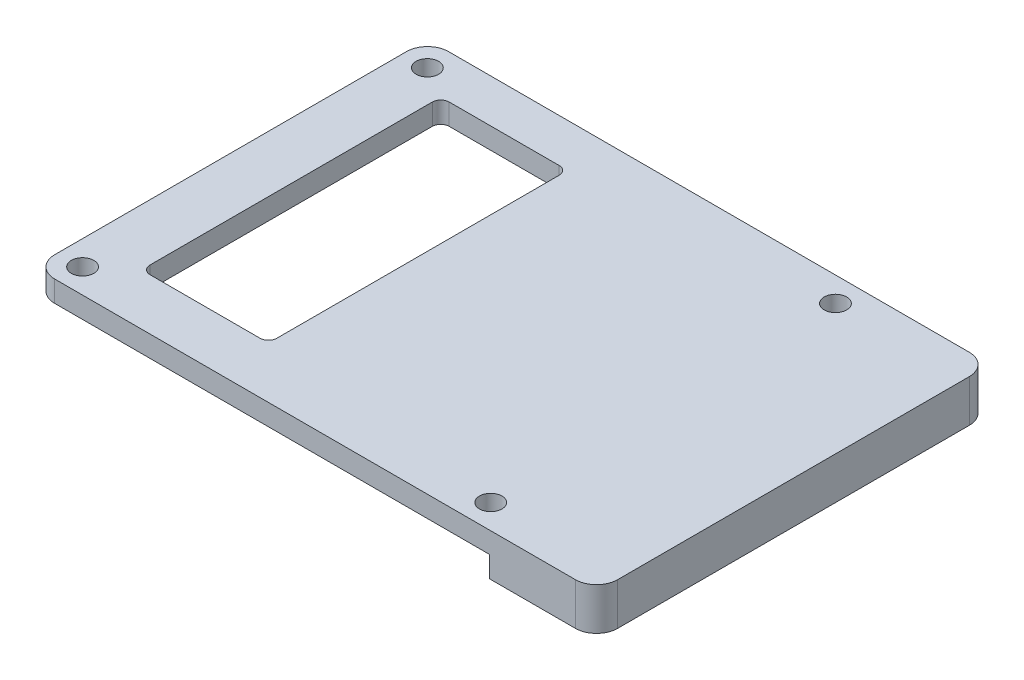
ISO-10303-21;
HEADER;
FILE_DESCRIPTION(('STEP AP214'),'2;1');
FILE_NAME('part.step','',(''),(''),'','','');
FILE_SCHEMA(('AUTOMOTIVE_DESIGN { 1 0 10303 214 1 1 1 1 }'));
ENDSEC;
DATA;
#1=APPLICATION_CONTEXT('core data for automotive mechanical design processes');
#2=APPLICATION_PROTOCOL_DEFINITION('international standard','automotive_design',2000,#1);
#3=PRODUCT_CONTEXT('',#1,'mechanical');
#4=PRODUCT('Part','Part','',(#3));
#5=PRODUCT_RELATED_PRODUCT_CATEGORY('part','',(#4));
#6=PRODUCT_DEFINITION_FORMATION('','',#4);
#7=PRODUCT_DEFINITION_CONTEXT('part definition',#1,'design');
#8=PRODUCT_DEFINITION('design','',#6,#7);
#9=PRODUCT_DEFINITION_SHAPE('','',#8);
#10=(LENGTH_UNIT() NAMED_UNIT(*) SI_UNIT(.MILLI.,.METRE.));
#11=(NAMED_UNIT(*) PLANE_ANGLE_UNIT() SI_UNIT($,.RADIAN.));
#12=(NAMED_UNIT(*) SI_UNIT($,.STERADIAN.) SOLID_ANGLE_UNIT());
#13=UNCERTAINTY_MEASURE_WITH_UNIT(LENGTH_MEASURE(1.E-05),#10,'distance_accuracy_value','');
#14=(GEOMETRIC_REPRESENTATION_CONTEXT(3) GLOBAL_UNCERTAINTY_ASSIGNED_CONTEXT((#13)) GLOBAL_UNIT_ASSIGNED_CONTEXT((#10,
#11,#12)) REPRESENTATION_CONTEXT('',''));
#15=CARTESIAN_POINT('',(0.,0.,0.));
#16=DIRECTION('',(0.,0.,1.));
#17=DIRECTION('',(1.,0.,0.));
#18=AXIS2_PLACEMENT_3D('',#15,#16,#17);
#19=CARTESIAN_POINT('',(-77.0217231267692,0.,-21.4026703774337));
#20=DIRECTION('',(0.,1.,0.));
#21=DIRECTION('',(0.,0.,1.));
#22=AXIS2_PLACEMENT_3D('',#19,#20,#21);
#23=PLANE('',#22);
#24=CARTESIAN_POINT('',(-70.7700597308106,0.,-17.0302829865601));
#25=DIRECTION('',(0.,1.,0.));
#26=DIRECTION('',(0.,0.,1.));
#27=AXIS2_PLACEMENT_3D('',#24,#25,#26);
#28=CIRCLE('',#27,1.2);
#29=CARTESIAN_POINT('',(-70.7700597308106,0.,-18.2302829865601));
#30=VERTEX_POINT('',#29);
#31=CARTESIAN_POINT('',(-71.9700597308106,0.,-17.03028298656));
#32=VERTEX_POINT('',#31);
#33=EDGE_CURVE('E189',#30,#32,#28,.T.);
#34=ORIENTED_EDGE('',*,*,#33,.T.);
#35=DIRECTION('',(0.,0.,1.));
#36=VECTOR('',#35,1.);
#37=CARTESIAN_POINT('',(-71.9700597308106,0.,-17.03028298656));
#38=LINE('',#37,#36);
#39=CARTESIAN_POINT('',(-71.9700597308106,0.,23.0884223106065));
#40=VERTEX_POINT('',#39);
#41=EDGE_CURVE('E193',#32,#40,#38,.T.);
#42=ORIENTED_EDGE('',*,*,#41,.T.);
#43=CARTESIAN_POINT('',(-70.7700597308106,0.,23.0884223106065));
#44=DIRECTION('',(0.,1.,0.));
#45=DIRECTION('',(0.,0.,-1.));
#46=AXIS2_PLACEMENT_3D('',#43,#44,#45);
#47=CIRCLE('',#46,1.2);
#48=CARTESIAN_POINT('',(-70.7700597308106,0.,24.2884223106065));
#49=VERTEX_POINT('',#48);
#50=EDGE_CURVE('E218',#40,#49,#47,.T.);
#51=ORIENTED_EDGE('',*,*,#50,.T.);
#52=DIRECTION('',(1.,0.,0.));
#53=VECTOR('',#52,1.);
#54=CARTESIAN_POINT('',(-70.7700597308106,0.,24.2884223106065));
#55=LINE('',#54,#53);
#56=CARTESIAN_POINT('',(-55.140568983521,0.,24.2884223106065));
#57=VERTEX_POINT('',#56);
#58=EDGE_CURVE('E221',#49,#57,#55,.T.);
#59=ORIENTED_EDGE('',*,*,#58,.T.);
#60=CARTESIAN_POINT('',(-55.140568983521,0.,23.0884223106065));
#61=DIRECTION('',(0.,1.,0.));
#62=DIRECTION('',(0.,0.,-1.));
#63=AXIS2_PLACEMENT_3D('',#60,#61,#62);
#64=CIRCLE('',#63,1.2);
#65=CARTESIAN_POINT('',(-53.940568983521,0.,23.0884223106065));
#66=VERTEX_POINT('',#65);
#67=EDGE_CURVE('E224',#57,#66,#64,.T.);
#68=ORIENTED_EDGE('',*,*,#67,.T.);
#69=DIRECTION('',(0.,0.,-1.));
#70=VECTOR('',#69,1.);
#71=CARTESIAN_POINT('',(-53.940568983521,0.,-17.03028298656));
#72=LINE('',#71,#70);
#73=CARTESIAN_POINT('',(-53.940568983521,0.,-17.03028298656));
#74=VERTEX_POINT('',#73);
#75=EDGE_CURVE('E227',#66,#74,#72,.T.);
#76=ORIENTED_EDGE('',*,*,#75,.T.);
#77=CARTESIAN_POINT('',(-55.140568983521,0.,-17.0302829865601));
#78=DIRECTION('',(0.,1.,0.));
#79=DIRECTION('',(0.,0.,1.));
#80=AXIS2_PLACEMENT_3D('',#77,#78,#79);
#81=CIRCLE('',#80,1.2);
#82=CARTESIAN_POINT('',(-55.140568983521,0.,-18.2302829865601));
#83=VERTEX_POINT('',#82);
#84=EDGE_CURVE('E230',#74,#83,#81,.T.);
#85=ORIENTED_EDGE('',*,*,#84,.T.);
#86=DIRECTION('',(-1.,0.,0.));
#87=VECTOR('',#86,1.);
#88=CARTESIAN_POINT('',(-70.7700597308106,0.,-18.2302829865601));
#89=LINE('',#88,#87);
#90=EDGE_CURVE('E201',#83,#30,#89,.T.);
#91=ORIENTED_EDGE('',*,*,#90,.T.);
#92=EDGE_LOOP('',(#34,#42,#51,#59,#68,#76,#85,#91));
#93=FACE_BOUND('',#92,.T.);
#94=CARTESIAN_POINT('',(-76.5284846202892,0.,-20.8867242255417));
#95=DIRECTION('',(0.,1.,0.));
#96=DIRECTION('',(0.,0.,1.));
#97=AXIS2_PLACEMENT_3D('',#94,#95,#96);
#98=CIRCLE('',#97,1.6);
#99=CARTESIAN_POINT('',(-76.5284846202892,0.,-19.2867242255417));
#100=VERTEX_POINT('',#99);
#101=EDGE_CURVE('E267',#100,#100,#98,.T.);
#102=ORIENTED_EDGE('',*,*,#101,.T.);
#103=EDGE_LOOP('',(#102));
#104=FACE_BOUND('',#103,.T.);
#105=CARTESIAN_POINT('',(-18.5285862204952,0.,-20.8865972252877));
#106=DIRECTION('',(0.,1.,0.));
#107=DIRECTION('',(0.,0.,1.));
#108=AXIS2_PLACEMENT_3D('',#105,#106,#107);
#109=CIRCLE('',#108,1.6);
#110=CARTESIAN_POINT('',(-18.5285862204952,0.,-19.2865972252877));
#111=VERTEX_POINT('',#110);
#112=EDGE_CURVE('E261',#111,#111,#109,.T.);
#113=ORIENTED_EDGE('',*,*,#112,.T.);
#114=EDGE_LOOP('',(#113));
#115=FACE_BOUND('',#114,.T.);
#116=CARTESIAN_POINT('',(-18.5283322199872,0.,28.1136567752183));
#117=DIRECTION('',(0.,1.,0.));
#118=DIRECTION('',(0.,0.,1.));
#119=AXIS2_PLACEMENT_3D('',#116,#117,#118);
#120=CIRCLE('',#119,1.6);
#121=CARTESIAN_POINT('',(-18.5283322199872,0.,29.7136567752183));
#122=VERTEX_POINT('',#121);
#123=EDGE_CURVE('E255',#122,#122,#120,.T.);
#124=ORIENTED_EDGE('',*,*,#123,.T.);
#125=EDGE_LOOP('',(#124));
#126=FACE_BOUND('',#125,.T.);
#127=CARTESIAN_POINT('',(-76.5283322199792,0.,28.1135297749583));
#128=DIRECTION('',(0.,1.,0.));
#129=DIRECTION('',(0.,0.,1.));
#130=AXIS2_PLACEMENT_3D('',#127,#128,#129);
#131=CIRCLE('',#130,1.6);
#132=CARTESIAN_POINT('',(-76.5283322199792,0.,29.7135297749583));
#133=VERTEX_POINT('',#132);
#134=EDGE_CURVE('E251',#133,#133,#131,.T.);
#135=ORIENTED_EDGE('',*,*,#134,.T.);
#136=EDGE_LOOP('',(#135));
#137=FACE_BOUND('',#136,.T.);
#138=DIRECTION('',(0.,0.,-1.));
#139=VECTOR('',#138,1.);
#140=CARTESIAN_POINT('',(-15.2270796572365,0.,31.5917365313783));
#141=LINE('',#140,#139);
#142=CARTESIAN_POINT('',(-15.2270796572365,0.,31.5917365313783));
#143=VERTEX_POINT('',#142);
#144=CARTESIAN_POINT('',(-15.2270796572365,0.,-24.3899754320437));
#145=VERTEX_POINT('',#144);
#146=EDGE_CURVE('E54',#143,#145,#141,.T.);
#147=ORIENTED_EDGE('',*,*,#146,.F.);
#148=DIRECTION('',(1.,0.,0.));
#149=VECTOR('',#148,1.);
#150=CARTESIAN_POINT('',(-77.0217231267692,0.,31.5917365313783));
#151=LINE('',#150,#149);
#152=CARTESIAN_POINT('',(-77.0217231267692,0.,31.5917365313783));
#153=VERTEX_POINT('',#152);
#154=EDGE_CURVE('E301',#153,#143,#151,.T.);
#155=ORIENTED_EDGE('',*,*,#154,.F.);
#156=CARTESIAN_POINT('',(-77.0217231267692,0.,28.6044314767683));
#157=DIRECTION('',(0.,1.,0.));
#158=DIRECTION('',(0.,0.,1.));
#159=AXIS2_PLACEMENT_3D('',#156,#157,#158);
#160=CIRCLE('',#159,2.98730505460999);
#161=CARTESIAN_POINT('',(-80.0090281813792,0.,28.6044314767683));
#162=VERTEX_POINT('',#161);
#163=EDGE_CURVE('E299',#162,#153,#160,.T.);
#164=ORIENTED_EDGE('',*,*,#163,.F.);
#165=DIRECTION('',(0.,0.,1.));
#166=VECTOR('',#165,1.);
#167=CARTESIAN_POINT('',(-80.0090281813792,0.,-21.4026703774337));
#168=LINE('',#167,#166);
#169=CARTESIAN_POINT('',(-80.0090281813792,0.,-21.4026703774337));
#170=VERTEX_POINT('',#169);
#171=EDGE_CURVE('E297',#170,#162,#168,.T.);
#172=ORIENTED_EDGE('',*,*,#171,.F.);
#173=CARTESIAN_POINT('',(-77.0217231267692,0.,-21.4026703774337));
#174=DIRECTION('',(0.,1.,0.));
#175=DIRECTION('',(0.,0.,1.));
#176=AXIS2_PLACEMENT_3D('',#173,#174,#175);
#177=CIRCLE('',#176,2.98730505461);
#178=CARTESIAN_POINT('',(-77.0217231267692,0.,-24.3899754320437));
#179=VERTEX_POINT('',#178);
#180=EDGE_CURVE('E273',#179,#170,#177,.T.);
#181=ORIENTED_EDGE('',*,*,#180,.F.);
#182=DIRECTION('',(-1.,0.,0.));
#183=VECTOR('',#182,1.);
#184=CARTESIAN_POINT('',(-3.00902818137926,0.,-24.3899754320437));
#185=LINE('',#184,#183);
#186=EDGE_CURVE('E280',#145,#179,#185,.T.);
#187=ORIENTED_EDGE('',*,*,#186,.F.);
#188=EDGE_LOOP('',(#147,#155,#164,#172,#181,#187));
#189=FACE_BOUND('',#188,.T.);
#190=ADVANCED_FACE('F39',(#93,#104,#115,#126,#137,#189),#23,.F.);
#191=CARTESIAN_POINT('',(-77.0217231267692,3.,-21.4026703774337));
#192=DIRECTION('',(0.,1.,0.));
#193=DIRECTION('',(0.,0.,1.));
#194=AXIS2_PLACEMENT_3D('',#191,#192,#193);
#195=PLANE('',#194);
#196=CARTESIAN_POINT('',(-18.5283322199872,3.,28.1136567752183));
#197=DIRECTION('',(0.,1.,0.));
#198=DIRECTION('',(0.,0.,1.));
#199=AXIS2_PLACEMENT_3D('',#196,#197,#198);
#200=CIRCLE('',#199,1.6);
#201=CARTESIAN_POINT('',(-18.5283322199872,3.,29.7136567752183));
#202=VERTEX_POINT('',#201);
#203=EDGE_CURVE('E258',#202,#202,#200,.T.);
#204=ORIENTED_EDGE('',*,*,#203,.F.);
#205=EDGE_LOOP('',(#204));
#206=FACE_BOUND('',#205,.T.);
#207=CARTESIAN_POINT('',(-76.5284846202892,3.,-20.8867242255417));
#208=DIRECTION('',(0.,1.,0.));
#209=DIRECTION('',(0.,0.,1.));
#210=AXIS2_PLACEMENT_3D('',#207,#208,#209);
#211=CIRCLE('',#210,1.6);
#212=CARTESIAN_POINT('',(-76.5284846202892,3.,-19.2867242255417));
#213=VERTEX_POINT('',#212);
#214=EDGE_CURVE('E270',#213,#213,#211,.T.);
#215=ORIENTED_EDGE('',*,*,#214,.F.);
#216=EDGE_LOOP('',(#215));
#217=FACE_BOUND('',#216,.T.);
#218=CARTESIAN_POINT('',(-77.0217231267692,3.,-21.4026703774337));
#219=DIRECTION('',(0.,1.,0.));
#220=DIRECTION('',(0.,0.,1.));
#221=AXIS2_PLACEMENT_3D('',#218,#219,#220);
#222=CIRCLE('',#221,2.98730505461);
#223=CARTESIAN_POINT('',(-77.0217231267692,3.,-24.3899754320437));
#224=VERTEX_POINT('',#223);
#225=CARTESIAN_POINT('',(-80.0090281813792,3.,-21.4026703774337));
#226=VERTEX_POINT('',#225);
#227=EDGE_CURVE('E276',#224,#226,#222,.T.);
#228=ORIENTED_EDGE('',*,*,#227,.T.);
#229=DIRECTION('',(0.,0.,1.));
#230=VECTOR('',#229,1.);
#231=CARTESIAN_POINT('',(-80.0090281813792,3.,-21.4026703774337));
#232=LINE('',#231,#230);
#233=CARTESIAN_POINT('',(-80.0090281813792,3.,28.6044314767683));
#234=VERTEX_POINT('',#233);
#235=EDGE_CURVE('E279',#226,#234,#232,.T.);
#236=ORIENTED_EDGE('',*,*,#235,.T.);
#237=CARTESIAN_POINT('',(-77.0217231267692,3.,28.6044314767683));
#238=DIRECTION('',(0.,1.,0.));
#239=DIRECTION('',(0.,0.,1.));
#240=AXIS2_PLACEMENT_3D('',#237,#238,#239);
#241=CIRCLE('',#240,2.98730505460999);
#242=CARTESIAN_POINT('',(-77.0217231267692,3.,31.5917365313783));
#243=VERTEX_POINT('',#242);
#244=EDGE_CURVE('E282',#234,#243,#241,.T.);
#245=ORIENTED_EDGE('',*,*,#244,.T.);
#246=DIRECTION('',(1.,0.,0.));
#247=VECTOR('',#246,1.);
#248=CARTESIAN_POINT('',(-77.0217231267692,3.,31.5917365313783));
#249=LINE('',#248,#247);
#250=CARTESIAN_POINT('',(-3.00902818137926,3.,31.5917365313783));
#251=VERTEX_POINT('',#250);
#252=EDGE_CURVE('E284',#243,#251,#249,.T.);
#253=ORIENTED_EDGE('',*,*,#252,.T.);
#254=CARTESIAN_POINT('',(-3.00902818137924,3.,28.5917365313783));
#255=DIRECTION('',(0.,1.,0.));
#256=DIRECTION('',(0.,0.,-1.));
#257=AXIS2_PLACEMENT_3D('',#254,#255,#256);
#258=CIRCLE('',#257,3.);
#259=CARTESIAN_POINT('',(-0.00902818137923965,3.,28.5917365313783));
#260=VERTEX_POINT('',#259);
#261=EDGE_CURVE('E286',#251,#260,#258,.T.);
#262=ORIENTED_EDGE('',*,*,#261,.T.);
#263=DIRECTION('',(0.,0.,-1.));
#264=VECTOR('',#263,1.);
#265=CARTESIAN_POINT('',(-0.00902818137923922,3.,-21.3899754320437));
#266=LINE('',#265,#264);
#267=CARTESIAN_POINT('',(-0.00902818137923922,3.,-21.3899754320437));
#268=VERTEX_POINT('',#267);
#269=EDGE_CURVE('E288',#260,#268,#266,.T.);
#270=ORIENTED_EDGE('',*,*,#269,.T.);
#271=CARTESIAN_POINT('',(-3.00902818137924,3.,-21.3899754320437));
#272=DIRECTION('',(0.,1.,0.));
#273=DIRECTION('',(0.,0.,1.));
#274=AXIS2_PLACEMENT_3D('',#271,#272,#273);
#275=CIRCLE('',#274,3.);
#276=CARTESIAN_POINT('',(-3.00902818137926,3.,-24.3899754320437));
#277=VERTEX_POINT('',#276);
#278=EDGE_CURVE('E290',#268,#277,#275,.T.);
#279=ORIENTED_EDGE('',*,*,#278,.T.);
#280=DIRECTION('',(-1.,0.,0.));
#281=VECTOR('',#280,1.);
#282=CARTESIAN_POINT('',(-3.00902818137926,3.,-24.3899754320437));
#283=LINE('',#282,#281);
#284=EDGE_CURVE('E292',#277,#224,#283,.T.);
#285=ORIENTED_EDGE('',*,*,#284,.T.);
#286=EDGE_LOOP('',(#228,#236,#245,#253,#262,#270,#279,#285));
#287=FACE_BOUND('',#286,.T.);
#288=CARTESIAN_POINT('',(-18.5285862204952,3.,-20.8865972252877));
#289=DIRECTION('',(0.,1.,0.));
#290=DIRECTION('',(0.,0.,1.));
#291=AXIS2_PLACEMENT_3D('',#288,#289,#290);
#292=CIRCLE('',#291,1.6);
#293=CARTESIAN_POINT('',(-18.5285862204952,3.,-19.2865972252877));
#294=VERTEX_POINT('',#293);
#295=EDGE_CURVE('E264',#294,#294,#292,.T.);
#296=ORIENTED_EDGE('',*,*,#295,.F.);
#297=EDGE_LOOP('',(#296));
#298=FACE_BOUND('',#297,.T.);
#299=CARTESIAN_POINT('',(-76.5283322199792,3.,28.1135297749583));
#300=DIRECTION('',(0.,1.,0.));
#301=DIRECTION('',(0.,0.,1.));
#302=AXIS2_PLACEMENT_3D('',#299,#300,#301);
#303=CIRCLE('',#302,1.6);
#304=CARTESIAN_POINT('',(-76.5283322199792,3.,29.7135297749583));
#305=VERTEX_POINT('',#304);
#306=EDGE_CURVE('E252',#305,#305,#303,.T.);
#307=ORIENTED_EDGE('',*,*,#306,.F.);
#308=EDGE_LOOP('',(#307));
#309=FACE_BOUND('',#308,.T.);
#310=DIRECTION('',(0.,0.,1.));
#311=VECTOR('',#310,1.);
#312=CARTESIAN_POINT('',(-71.9700597308106,3.,-17.03028298656));
#313=LINE('',#312,#311);
#314=CARTESIAN_POINT('',(-71.9700597308106,3.,-17.03028298656));
#315=VERTEX_POINT('',#314);
#316=CARTESIAN_POINT('',(-71.9700597308106,3.,23.0884223106065));
#317=VERTEX_POINT('',#316);
#318=EDGE_CURVE('E200',#315,#317,#313,.T.);
#319=ORIENTED_EDGE('',*,*,#318,.F.);
#320=CARTESIAN_POINT('',(-70.7700597308106,3.,-17.0302829865601));
#321=DIRECTION('',(0.,1.,0.));
#322=DIRECTION('',(0.,0.,1.));
#323=AXIS2_PLACEMENT_3D('',#320,#321,#322);
#324=CIRCLE('',#323,1.2);
#325=CARTESIAN_POINT('',(-70.7700597308106,3.,-18.2302829865601));
#326=VERTEX_POINT('',#325);
#327=EDGE_CURVE('E198',#326,#315,#324,.T.);
#328=ORIENTED_EDGE('',*,*,#327,.F.);
#329=DIRECTION('',(-1.,0.,0.));
#330=VECTOR('',#329,1.);
#331=CARTESIAN_POINT('',(-70.7700597308106,3.,-18.2302829865601));
#332=LINE('',#331,#330);
#333=CARTESIAN_POINT('',(-55.140568983521,3.,-18.2302829865601));
#334=VERTEX_POINT('',#333);
#335=EDGE_CURVE('E213',#334,#326,#332,.T.);
#336=ORIENTED_EDGE('',*,*,#335,.F.);
#337=CARTESIAN_POINT('',(-55.140568983521,3.,-17.0302829865601));
#338=DIRECTION('',(0.,1.,0.));
#339=DIRECTION('',(0.,0.,1.));
#340=AXIS2_PLACEMENT_3D('',#337,#338,#339);
#341=CIRCLE('',#340,1.2);
#342=CARTESIAN_POINT('',(-53.940568983521,3.,-17.03028298656));
#343=VERTEX_POINT('',#342);
#344=EDGE_CURVE('E211',#343,#334,#341,.T.);
#345=ORIENTED_EDGE('',*,*,#344,.F.);
#346=DIRECTION('',(0.,0.,-1.));
#347=VECTOR('',#346,1.);
#348=CARTESIAN_POINT('',(-53.940568983521,3.,-17.03028298656));
#349=LINE('',#348,#347);
#350=CARTESIAN_POINT('',(-53.940568983521,3.,23.0884223106065));
#351=VERTEX_POINT('',#350);
#352=EDGE_CURVE('E209',#351,#343,#349,.T.);
#353=ORIENTED_EDGE('',*,*,#352,.F.);
#354=CARTESIAN_POINT('',(-55.140568983521,3.,23.0884223106065));
#355=DIRECTION('',(0.,1.,0.));
#356=DIRECTION('',(0.,0.,-1.));
#357=AXIS2_PLACEMENT_3D('',#354,#355,#356);
#358=CIRCLE('',#357,1.2);
#359=CARTESIAN_POINT('',(-55.140568983521,3.,24.2884223106065));
#360=VERTEX_POINT('',#359);
#361=EDGE_CURVE('E207',#360,#351,#358,.T.);
#362=ORIENTED_EDGE('',*,*,#361,.F.);
#363=DIRECTION('',(1.,0.,0.));
#364=VECTOR('',#363,1.);
#365=CARTESIAN_POINT('',(-70.7700597308106,3.,24.2884223106065));
#366=LINE('',#365,#364);
#367=CARTESIAN_POINT('',(-70.7700597308106,3.,24.2884223106065));
#368=VERTEX_POINT('',#367);
#369=EDGE_CURVE('E205',#368,#360,#366,.T.);
#370=ORIENTED_EDGE('',*,*,#369,.F.);
#371=CARTESIAN_POINT('',(-70.7700597308106,3.,23.0884223106065));
#372=DIRECTION('',(0.,1.,0.));
#373=DIRECTION('',(0.,0.,-1.));
#374=AXIS2_PLACEMENT_3D('',#371,#372,#373);
#375=CIRCLE('',#374,1.2);
#376=EDGE_CURVE('E203',#317,#368,#375,.T.);
#377=ORIENTED_EDGE('',*,*,#376,.F.);
#378=EDGE_LOOP('',(#319,#328,#336,#345,#353,#362,#370,#377));
#379=FACE_BOUND('',#378,.T.);
#380=ADVANCED_FACE('F330',(#206,#217,#287,#298,#309,#379),#195,.T.);
#381=CARTESIAN_POINT('',(-77.0217231267692,3.,-21.4026703774337));
#382=DIRECTION('',(0.,-1.,0.));
#383=DIRECTION('',(0.,0.,-1.));
#384=AXIS2_PLACEMENT_3D('',#381,#382,#383);
#385=CYLINDRICAL_SURFACE('',#384,2.98730505461);
#386=ORIENTED_EDGE('',*,*,#180,.T.);
#387=DIRECTION('',(0.,-1.,0.));
#388=VECTOR('',#387,1.);
#389=CARTESIAN_POINT('',(-80.0090281813792,3.,-21.4026703774337));
#390=LINE('',#389,#388);
#391=EDGE_CURVE('E11',#226,#170,#390,.T.);
#392=ORIENTED_EDGE('',*,*,#391,.F.);
#393=ORIENTED_EDGE('',*,*,#227,.F.);
#394=DIRECTION('',(0.,-1.,0.));
#395=VECTOR('',#394,1.);
#396=CARTESIAN_POINT('',(-77.0217231267692,3.,-24.3899754320437));
#397=LINE('',#396,#395);
#398=EDGE_CURVE('E294',#224,#179,#397,.T.);
#399=ORIENTED_EDGE('',*,*,#398,.T.);
#400=EDGE_LOOP('',(#386,#392,#393,#399));
#401=FACE_BOUND('',#400,.T.);
#402=ADVANCED_FACE('F41',(#401),#385,.T.);
#403=CARTESIAN_POINT('',(-80.0090281813792,3.,-21.4026703774337));
#404=DIRECTION('',(1.,0.,0.));
#405=DIRECTION('',(0.,0.,-1.));
#406=AXIS2_PLACEMENT_3D('',#403,#404,#405);
#407=PLANE('',#406);
#408=ORIENTED_EDGE('',*,*,#171,.T.);
#409=DIRECTION('',(0.,-1.,0.));
#410=VECTOR('',#409,1.);
#411=CARTESIAN_POINT('',(-80.0090281813792,3.,28.6044314767683));
#412=LINE('',#411,#410);
#413=EDGE_CURVE('E47',#234,#162,#412,.T.);
#414=ORIENTED_EDGE('',*,*,#413,.F.);
#415=ORIENTED_EDGE('',*,*,#235,.F.);
#416=ORIENTED_EDGE('',*,*,#391,.T.);
#417=EDGE_LOOP('',(#408,#414,#415,#416));
#418=FACE_BOUND('',#417,.T.);
#419=ADVANCED_FACE('F335',(#418),#407,.F.);
#420=CARTESIAN_POINT('',(-77.0217231267692,3.,28.6044314767683));
#421=DIRECTION('',(0.,-1.,0.));
#422=DIRECTION('',(0.,0.,-1.));
#423=AXIS2_PLACEMENT_3D('',#420,#421,#422);
#424=CYLINDRICAL_SURFACE('',#423,2.98730505460999);
#425=ORIENTED_EDGE('',*,*,#163,.T.);
#426=DIRECTION('',(0.,-1.,0.));
#427=VECTOR('',#426,1.);
#428=CARTESIAN_POINT('',(-77.0217231267692,3.,31.5917365313783));
#429=LINE('',#428,#427);
#430=EDGE_CURVE('E313',#243,#153,#429,.T.);
#431=ORIENTED_EDGE('',*,*,#430,.F.);
#432=ORIENTED_EDGE('',*,*,#244,.F.);
#433=ORIENTED_EDGE('',*,*,#413,.T.);
#434=EDGE_LOOP('',(#425,#431,#432,#433));
#435=FACE_BOUND('',#434,.T.);
#436=ADVANCED_FACE('F320',(#435),#424,.T.);
#437=CARTESIAN_POINT('',(-77.0217231267692,3.,31.5917365313783));
#438=DIRECTION('',(0.,0.,-1.));
#439=DIRECTION('',(-1.,0.,0.));
#440=AXIS2_PLACEMENT_3D('',#437,#438,#439);
#441=PLANE('',#440);
#442=ORIENTED_EDGE('',*,*,#154,.T.);
#443=DIRECTION('',(0.,1.,0.));
#444=VECTOR('',#443,1.);
#445=CARTESIAN_POINT('',(-15.2270796572365,-3.,31.5917365313783));
#446=LINE('',#445,#444);
#447=CARTESIAN_POINT('',(-15.2270796572365,-3.,31.5917365313783));
#448=VERTEX_POINT('',#447);
#449=EDGE_CURVE('E190',#448,#143,#446,.T.);
#450=ORIENTED_EDGE('',*,*,#449,.F.);
#451=DIRECTION('',(-1.,0.,0.));
#452=VECTOR('',#451,1.);
#453=CARTESIAN_POINT('',(-15.2270796572365,-3.,31.5917365313783));
#454=LINE('',#453,#452);
#455=CARTESIAN_POINT('',(-3.00902818137926,-3.,31.5917365313783));
#456=VERTEX_POINT('',#455);
#457=EDGE_CURVE('E183',#456,#448,#454,.T.);
#458=ORIENTED_EDGE('',*,*,#457,.F.);
#459=DIRECTION('',(0.,-1.,0.));
#460=VECTOR('',#459,1.);
#461=CARTESIAN_POINT('',(-3.00902818137926,3.,31.5917365313783));
#462=LINE('',#461,#460);
#463=EDGE_CURVE('E311',#251,#456,#462,.T.);
#464=ORIENTED_EDGE('',*,*,#463,.F.);
#465=ORIENTED_EDGE('',*,*,#252,.F.);
#466=ORIENTED_EDGE('',*,*,#430,.T.);
#467=EDGE_LOOP('',(#442,#450,#458,#464,#465,#466));
#468=FACE_BOUND('',#467,.T.);
#469=ADVANCED_FACE('F325',(#468),#441,.F.);
#470=CARTESIAN_POINT('',(-3.00902818137924,3.,28.5917365313783));
#471=DIRECTION('',(0.,-1.,0.));
#472=DIRECTION('',(0.,0.,-1.));
#473=AXIS2_PLACEMENT_3D('',#470,#471,#472);
#474=CYLINDRICAL_SURFACE('',#473,3.);
#475=ORIENTED_EDGE('',*,*,#463,.T.);
#476=CARTESIAN_POINT('',(-3.00902818137924,-3.,28.5917365313783));
#477=DIRECTION('',(0.,-1.,0.));
#478=DIRECTION('',(0.,0.,1.));
#479=AXIS2_PLACEMENT_3D('',#476,#477,#478);
#480=CIRCLE('',#479,3.);
#481=CARTESIAN_POINT('',(-0.00902818137924139,-3.,28.5917365313783));
#482=VERTEX_POINT('',#481);
#483=EDGE_CURVE('E347',#482,#456,#480,.T.);
#484=ORIENTED_EDGE('',*,*,#483,.F.);
#485=DIRECTION('',(0.,-1.,0.));
#486=VECTOR('',#485,1.);
#487=CARTESIAN_POINT('',(-0.00902818137923965,3.,28.5917365313783));
#488=LINE('',#487,#486);
#489=EDGE_CURVE('E309',#260,#482,#488,.T.);
#490=ORIENTED_EDGE('',*,*,#489,.F.);
#491=ORIENTED_EDGE('',*,*,#261,.F.);
#492=EDGE_LOOP('',(#475,#484,#490,#491));
#493=FACE_BOUND('',#492,.T.);
#494=ADVANCED_FACE('F353',(#493),#474,.T.);
#495=CARTESIAN_POINT('',(-0.00902818137923922,3.,-21.3899754320437));
#496=DIRECTION('',(-1.,0.,0.));
#497=DIRECTION('',(0.,0.,1.));
#498=AXIS2_PLACEMENT_3D('',#495,#496,#497);
#499=PLANE('',#498);
#500=ORIENTED_EDGE('',*,*,#489,.T.);
#501=DIRECTION('',(0.,0.,1.));
#502=VECTOR('',#501,1.);
#503=CARTESIAN_POINT('',(-0.00902818137924108,-3.,28.5917365313783));
#504=LINE('',#503,#502);
#505=CARTESIAN_POINT('',(-0.00902818137923945,-3.,-21.3899754320437));
#506=VERTEX_POINT('',#505);
#507=EDGE_CURVE('E345',#506,#482,#504,.T.);
#508=ORIENTED_EDGE('',*,*,#507,.F.);
#509=DIRECTION('',(0.,-1.,0.));
#510=VECTOR('',#509,1.);
#511=CARTESIAN_POINT('',(-0.00902818137923922,3.,-21.3899754320437));
#512=LINE('',#511,#510);
#513=EDGE_CURVE('E307',#268,#506,#512,.T.);
#514=ORIENTED_EDGE('',*,*,#513,.F.);
#515=ORIENTED_EDGE('',*,*,#269,.F.);
#516=EDGE_LOOP('',(#500,#508,#514,#515));
#517=FACE_BOUND('',#516,.T.);
#518=ADVANCED_FACE('F355',(#517),#499,.F.);
#519=CARTESIAN_POINT('',(-3.00902818137924,3.,-21.3899754320437));
#520=DIRECTION('',(0.,-1.,0.));
#521=DIRECTION('',(0.,0.,-1.));
#522=AXIS2_PLACEMENT_3D('',#519,#520,#521);
#523=CYLINDRICAL_SURFACE('',#522,3.);
#524=ORIENTED_EDGE('',*,*,#513,.T.);
#525=CARTESIAN_POINT('',(-3.00902818137924,-3.,-21.3899754320437));
#526=DIRECTION('',(0.,-1.,0.));
#527=DIRECTION('',(0.,0.,1.));
#528=AXIS2_PLACEMENT_3D('',#525,#526,#527);
#529=CIRCLE('',#528,3.);
#530=CARTESIAN_POINT('',(-3.00902818137926,-3.,-24.3899754320437));
#531=VERTEX_POINT('',#530);
#532=EDGE_CURVE('E176',#531,#506,#529,.T.);
#533=ORIENTED_EDGE('',*,*,#532,.F.);
#534=DIRECTION('',(0.,-1.,0.));
#535=VECTOR('',#534,1.);
#536=CARTESIAN_POINT('',(-3.00902818137926,3.,-24.3899754320437));
#537=LINE('',#536,#535);
#538=EDGE_CURVE('E172',#277,#531,#537,.T.);
#539=ORIENTED_EDGE('',*,*,#538,.F.);
#540=ORIENTED_EDGE('',*,*,#278,.F.);
#541=EDGE_LOOP('',(#524,#533,#539,#540));
#542=FACE_BOUND('',#541,.T.);
#543=ADVANCED_FACE('F342',(#542),#523,.T.);
#544=CARTESIAN_POINT('',(-3.00902818137926,3.,-24.3899754320437));
#545=DIRECTION('',(0.,0.,1.));
#546=DIRECTION('',(1.,0.,0.));
#547=AXIS2_PLACEMENT_3D('',#544,#545,#546);
#548=PLANE('',#547);
#549=ORIENTED_EDGE('',*,*,#538,.T.);
#550=DIRECTION('',(1.,0.,0.));
#551=VECTOR('',#550,1.);
#552=CARTESIAN_POINT('',(-15.2270796572365,-3.,-24.3899754320437));
#553=LINE('',#552,#551);
#554=CARTESIAN_POINT('',(-15.2270796572365,-3.,-24.3899754320437));
#555=VERTEX_POINT('',#554);
#556=EDGE_CURVE('E165',#555,#531,#553,.T.);
#557=ORIENTED_EDGE('',*,*,#556,.F.);
#558=DIRECTION('',(0.,1.,0.));
#559=VECTOR('',#558,1.);
#560=CARTESIAN_POINT('',(-15.2270796572365,-3.,-24.3899754320437));
#561=LINE('',#560,#559);
#562=EDGE_CURVE('E169',#555,#145,#561,.T.);
#563=ORIENTED_EDGE('',*,*,#562,.T.);
#564=ORIENTED_EDGE('',*,*,#186,.T.);
#565=ORIENTED_EDGE('',*,*,#398,.F.);
#566=ORIENTED_EDGE('',*,*,#284,.F.);
#567=EDGE_LOOP('',(#549,#557,#563,#564,#565,#566));
#568=FACE_BOUND('',#567,.T.);
#569=ADVANCED_FACE('F167',(#568),#548,.F.);
#570=CARTESIAN_POINT('',(-76.5284846202892,3.,-20.8867242255417));
#571=DIRECTION('',(0.,-1.,0.));
#572=DIRECTION('',(0.,0.,-1.));
#573=AXIS2_PLACEMENT_3D('',#570,#571,#572);
#574=CYLINDRICAL_SURFACE('',#573,1.6);
#575=ORIENTED_EDGE('',*,*,#214,.T.);
#576=EDGE_LOOP('',(#575));
#577=FACE_BOUND('',#576,.T.);
#578=ORIENTED_EDGE('',*,*,#101,.F.);
#579=EDGE_LOOP('',(#578));
#580=FACE_BOUND('',#579,.T.);
#581=ADVANCED_FACE('F376',(#577,#580),#574,.F.);
#582=CARTESIAN_POINT('',(-18.5285862204952,3.,-20.8865972252877));
#583=DIRECTION('',(0.,-1.,0.));
#584=DIRECTION('',(0.,0.,-1.));
#585=AXIS2_PLACEMENT_3D('',#582,#583,#584);
#586=CYLINDRICAL_SURFACE('',#585,1.6);
#587=ORIENTED_EDGE('',*,*,#295,.T.);
#588=EDGE_LOOP('',(#587));
#589=FACE_BOUND('',#588,.T.);
#590=ORIENTED_EDGE('',*,*,#112,.F.);
#591=EDGE_LOOP('',(#590));
#592=FACE_BOUND('',#591,.T.);
#593=ADVANCED_FACE('F380',(#589,#592),#586,.F.);
#594=CARTESIAN_POINT('',(-18.5283322199872,3.,28.1136567752183));
#595=DIRECTION('',(0.,-1.,0.));
#596=DIRECTION('',(0.,0.,-1.));
#597=AXIS2_PLACEMENT_3D('',#594,#595,#596);
#598=CYLINDRICAL_SURFACE('',#597,1.6);
#599=ORIENTED_EDGE('',*,*,#203,.T.);
#600=EDGE_LOOP('',(#599));
#601=FACE_BOUND('',#600,.T.);
#602=ORIENTED_EDGE('',*,*,#123,.F.);
#603=EDGE_LOOP('',(#602));
#604=FACE_BOUND('',#603,.T.);
#605=ADVANCED_FACE('F385',(#601,#604),#598,.F.);
#606=CARTESIAN_POINT('',(-76.5283322199792,3.,28.1135297749583));
#607=DIRECTION('',(0.,-1.,0.));
#608=DIRECTION('',(0.,0.,-1.));
#609=AXIS2_PLACEMENT_3D('',#606,#607,#608);
#610=CYLINDRICAL_SURFACE('',#609,1.6);
#611=ORIENTED_EDGE('',*,*,#306,.T.);
#612=EDGE_LOOP('',(#611));
#613=FACE_BOUND('',#612,.T.);
#614=ORIENTED_EDGE('',*,*,#134,.F.);
#615=EDGE_LOOP('',(#614));
#616=FACE_BOUND('',#615,.T.);
#617=ADVANCED_FACE('F392',(#613,#616),#610,.F.);
#618=CARTESIAN_POINT('',(-70.7700597308106,3.,-17.0302829865601));
#619=DIRECTION('',(0.,-1.,0.));
#620=DIRECTION('',(0.,0.,-1.));
#621=AXIS2_PLACEMENT_3D('',#618,#619,#620);
#622=CYLINDRICAL_SURFACE('',#621,1.2);
#623=ORIENTED_EDGE('',*,*,#33,.F.);
#624=DIRECTION('',(0.,-1.,0.));
#625=VECTOR('',#624,1.);
#626=CARTESIAN_POINT('',(-70.7700597308106,3.,-18.2302829865601));
#627=LINE('',#626,#625);
#628=EDGE_CURVE('E214',#326,#30,#627,.T.);
#629=ORIENTED_EDGE('',*,*,#628,.F.);
#630=ORIENTED_EDGE('',*,*,#327,.T.);
#631=DIRECTION('',(0.,-1.,0.));
#632=VECTOR('',#631,1.);
#633=CARTESIAN_POINT('',(-71.9700597308106,3.,-17.03028298656));
#634=LINE('',#633,#632);
#635=EDGE_CURVE('E248',#315,#32,#634,.T.);
#636=ORIENTED_EDGE('',*,*,#635,.T.);
#637=EDGE_LOOP('',(#623,#629,#630,#636));
#638=FACE_BOUND('',#637,.T.);
#639=ADVANCED_FACE('F396',(#638),#622,.F.);
#640=CARTESIAN_POINT('',(-71.9700597308106,3.,-17.03028298656));
#641=DIRECTION('',(1.,0.,0.));
#642=DIRECTION('',(0.,0.,-1.));
#643=AXIS2_PLACEMENT_3D('',#640,#641,#642);
#644=PLANE('',#643);
#645=ORIENTED_EDGE('',*,*,#41,.F.);
#646=ORIENTED_EDGE('',*,*,#635,.F.);
#647=ORIENTED_EDGE('',*,*,#318,.T.);
#648=DIRECTION('',(0.,-1.,0.));
#649=VECTOR('',#648,1.);
#650=CARTESIAN_POINT('',(-71.9700597308106,3.,23.0884223106065));
#651=LINE('',#650,#649);
#652=EDGE_CURVE('E246',#317,#40,#651,.T.);
#653=ORIENTED_EDGE('',*,*,#652,.T.);
#654=EDGE_LOOP('',(#645,#646,#647,#653));
#655=FACE_BOUND('',#654,.T.);
#656=ADVANCED_FACE('F400',(#655),#644,.T.);
#657=CARTESIAN_POINT('',(-70.7700597308106,3.,23.0884223106065));
#658=DIRECTION('',(0.,-1.,0.));
#659=DIRECTION('',(0.,0.,-1.));
#660=AXIS2_PLACEMENT_3D('',#657,#658,#659);
#661=CYLINDRICAL_SURFACE('',#660,1.2);
#662=ORIENTED_EDGE('',*,*,#50,.F.);
#663=ORIENTED_EDGE('',*,*,#652,.F.);
#664=ORIENTED_EDGE('',*,*,#376,.T.);
#665=DIRECTION('',(0.,-1.,0.));
#666=VECTOR('',#665,1.);
#667=CARTESIAN_POINT('',(-70.7700597308106,3.,24.2884223106065));
#668=LINE('',#667,#666);
#669=EDGE_CURVE('E244',#368,#49,#668,.T.);
#670=ORIENTED_EDGE('',*,*,#669,.T.);
#671=EDGE_LOOP('',(#662,#663,#664,#670));
#672=FACE_BOUND('',#671,.T.);
#673=ADVANCED_FACE('F404',(#672),#661,.F.);
#674=CARTESIAN_POINT('',(-70.7700597308106,3.,24.2884223106065));
#675=DIRECTION('',(0.,0.,-1.));
#676=DIRECTION('',(-1.,0.,0.));
#677=AXIS2_PLACEMENT_3D('',#674,#675,#676);
#678=PLANE('',#677);
#679=ORIENTED_EDGE('',*,*,#58,.F.);
#680=ORIENTED_EDGE('',*,*,#669,.F.);
#681=ORIENTED_EDGE('',*,*,#369,.T.);
#682=DIRECTION('',(0.,-1.,0.));
#683=VECTOR('',#682,1.);
#684=CARTESIAN_POINT('',(-55.140568983521,3.,24.2884223106065));
#685=LINE('',#684,#683);
#686=EDGE_CURVE('E242',#360,#57,#685,.T.);
#687=ORIENTED_EDGE('',*,*,#686,.T.);
#688=EDGE_LOOP('',(#679,#680,#681,#687));
#689=FACE_BOUND('',#688,.T.);
#690=ADVANCED_FACE('F408',(#689),#678,.T.);
#691=CARTESIAN_POINT('',(-55.140568983521,3.,23.0884223106065));
#692=DIRECTION('',(0.,-1.,0.));
#693=DIRECTION('',(0.,0.,-1.));
#694=AXIS2_PLACEMENT_3D('',#691,#692,#693);
#695=CYLINDRICAL_SURFACE('',#694,1.2);
#696=ORIENTED_EDGE('',*,*,#67,.F.);
#697=ORIENTED_EDGE('',*,*,#686,.F.);
#698=ORIENTED_EDGE('',*,*,#361,.T.);
#699=DIRECTION('',(0.,-1.,0.));
#700=VECTOR('',#699,1.);
#701=CARTESIAN_POINT('',(-53.940568983521,3.,23.0884223106065));
#702=LINE('',#701,#700);
#703=EDGE_CURVE('E240',#351,#66,#702,.T.);
#704=ORIENTED_EDGE('',*,*,#703,.T.);
#705=EDGE_LOOP('',(#696,#697,#698,#704));
#706=FACE_BOUND('',#705,.T.);
#707=ADVANCED_FACE('F412',(#706),#695,.F.);
#708=CARTESIAN_POINT('',(-53.940568983521,3.,-17.03028298656));
#709=DIRECTION('',(-1.,0.,0.));
#710=DIRECTION('',(0.,0.,1.));
#711=AXIS2_PLACEMENT_3D('',#708,#709,#710);
#712=PLANE('',#711);
#713=ORIENTED_EDGE('',*,*,#75,.F.);
#714=ORIENTED_EDGE('',*,*,#703,.F.);
#715=ORIENTED_EDGE('',*,*,#352,.T.);
#716=DIRECTION('',(0.,-1.,0.));
#717=VECTOR('',#716,1.);
#718=CARTESIAN_POINT('',(-53.940568983521,3.,-17.03028298656));
#719=LINE('',#718,#717);
#720=EDGE_CURVE('E238',#343,#74,#719,.T.);
#721=ORIENTED_EDGE('',*,*,#720,.T.);
#722=EDGE_LOOP('',(#713,#714,#715,#721));
#723=FACE_BOUND('',#722,.T.);
#724=ADVANCED_FACE('F416',(#723),#712,.T.);
#725=CARTESIAN_POINT('',(-55.140568983521,3.,-17.0302829865601));
#726=DIRECTION('',(0.,-1.,0.));
#727=DIRECTION('',(0.,0.,-1.));
#728=AXIS2_PLACEMENT_3D('',#725,#726,#727);
#729=CYLINDRICAL_SURFACE('',#728,1.2);
#730=ORIENTED_EDGE('',*,*,#84,.F.);
#731=ORIENTED_EDGE('',*,*,#720,.F.);
#732=ORIENTED_EDGE('',*,*,#344,.T.);
#733=DIRECTION('',(0.,-1.,0.));
#734=VECTOR('',#733,1.);
#735=CARTESIAN_POINT('',(-55.140568983521,3.,-18.2302829865601));
#736=LINE('',#735,#734);
#737=EDGE_CURVE('E62',#334,#83,#736,.T.);
#738=ORIENTED_EDGE('',*,*,#737,.T.);
#739=EDGE_LOOP('',(#730,#731,#732,#738));
#740=FACE_BOUND('',#739,.T.);
#741=ADVANCED_FACE('F420',(#740),#729,.F.);
#742=CARTESIAN_POINT('',(-70.7700597308106,3.,-18.2302829865601));
#743=DIRECTION('',(0.,0.,1.));
#744=DIRECTION('',(1.,0.,0.));
#745=AXIS2_PLACEMENT_3D('',#742,#743,#744);
#746=PLANE('',#745);
#747=ORIENTED_EDGE('',*,*,#90,.F.);
#748=ORIENTED_EDGE('',*,*,#737,.F.);
#749=ORIENTED_EDGE('',*,*,#335,.T.);
#750=ORIENTED_EDGE('',*,*,#628,.T.);
#751=EDGE_LOOP('',(#747,#748,#749,#750));
#752=FACE_BOUND('',#751,.T.);
#753=ADVANCED_FACE('F424',(#752),#746,.T.);
#754=CARTESIAN_POINT('',(-15.2270796572365,-3.,31.5917365313783));
#755=DIRECTION('',(1.,0.,0.));
#756=DIRECTION('',(0.,0.,-1.));
#757=AXIS2_PLACEMENT_3D('',#754,#755,#756);
#758=PLANE('',#757);
#759=ORIENTED_EDGE('',*,*,#146,.T.);
#760=ORIENTED_EDGE('',*,*,#562,.F.);
#761=DIRECTION('',(0.,0.,-1.));
#762=VECTOR('',#761,1.);
#763=CARTESIAN_POINT('',(-15.2270796572365,-3.,31.5917365313783));
#764=LINE('',#763,#762);
#765=EDGE_CURVE('E177',#448,#555,#764,.T.);
#766=ORIENTED_EDGE('',*,*,#765,.F.);
#767=ORIENTED_EDGE('',*,*,#449,.T.);
#768=EDGE_LOOP('',(#759,#760,#766,#767));
#769=FACE_BOUND('',#768,.T.);
#770=ADVANCED_FACE('F188',(#769),#758,.F.);
#771=CARTESIAN_POINT('',(-3.00902818137924,-3.,-21.3899754320437));
#772=DIRECTION('',(0.,1.,0.));
#773=DIRECTION('',(0.,0.,1.));
#774=AXIS2_PLACEMENT_3D('',#771,#772,#773);
#775=PLANE('',#774);
#776=ORIENTED_EDGE('',*,*,#765,.T.);
#777=ORIENTED_EDGE('',*,*,#556,.T.);
#778=ORIENTED_EDGE('',*,*,#532,.T.);
#779=ORIENTED_EDGE('',*,*,#507,.T.);
#780=ORIENTED_EDGE('',*,*,#483,.T.);
#781=ORIENTED_EDGE('',*,*,#457,.T.);
#782=EDGE_LOOP('',(#776,#777,#778,#779,#780,#781));
#783=FACE_BOUND('',#782,.T.);
#784=ADVANCED_FACE('F180',(#783),#775,.F.);
#785=CLOSED_SHELL('',(#190,#380,#402,#419,#436,#469,#494,#518,#543,#569,#581,#593,#605,#617,
#639,#656,#673,#690,#707,#724,#741,#753,#770,#784));
#786=MANIFOLD_SOLID_BREP('B2',#785);
#787=ADVANCED_BREP_SHAPE_REPRESENTATION('',(#18,#786),#14);
#788=SHAPE_DEFINITION_REPRESENTATION(#9,#787);
ENDSEC;
END-ISO-10303-21;
